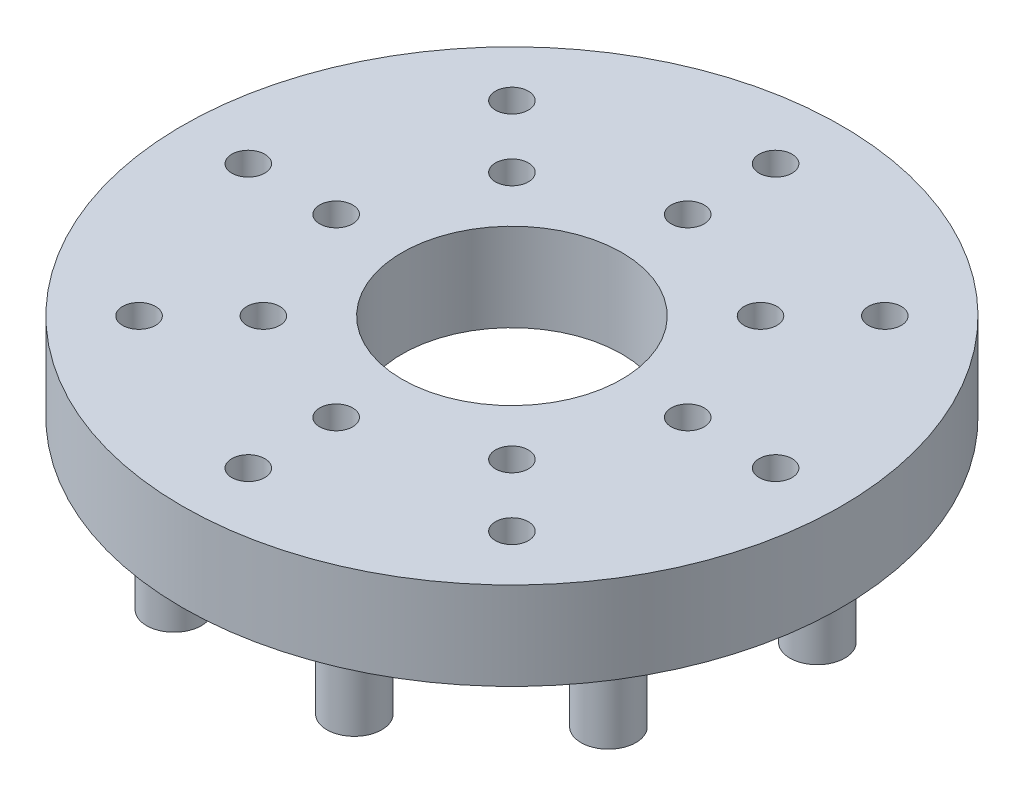
ISO-10303-21;
HEADER;
FILE_DESCRIPTION(('STEP AP214'),'2;1');
FILE_NAME('part.step','',(''),(''),'','','');
FILE_SCHEMA(('AUTOMOTIVE_DESIGN { 1 0 10303 214 1 1 1 1 }'));
ENDSEC;
DATA;
#1=APPLICATION_CONTEXT('core data for automotive mechanical design processes');
#2=APPLICATION_PROTOCOL_DEFINITION('international standard','automotive_design',2000,#1);
#3=PRODUCT_CONTEXT('',#1,'mechanical');
#4=PRODUCT('Part','Part','',(#3));
#5=PRODUCT_RELATED_PRODUCT_CATEGORY('part','',(#4));
#6=PRODUCT_DEFINITION_FORMATION('','',#4);
#7=PRODUCT_DEFINITION_CONTEXT('part definition',#1,'design');
#8=PRODUCT_DEFINITION('design','',#6,#7);
#9=PRODUCT_DEFINITION_SHAPE('','',#8);
#10=(LENGTH_UNIT() NAMED_UNIT(*) SI_UNIT(.MILLI.,.METRE.));
#11=(NAMED_UNIT(*) PLANE_ANGLE_UNIT() SI_UNIT($,.RADIAN.));
#12=(NAMED_UNIT(*) SI_UNIT($,.STERADIAN.) SOLID_ANGLE_UNIT());
#13=UNCERTAINTY_MEASURE_WITH_UNIT(LENGTH_MEASURE(1.E-05),#10,'distance_accuracy_value','');
#14=(GEOMETRIC_REPRESENTATION_CONTEXT(3) GLOBAL_UNCERTAINTY_ASSIGNED_CONTEXT((#13)) GLOBAL_UNIT_ASSIGNED_CONTEXT((#10,
#11,#12)) REPRESENTATION_CONTEXT('',''));
#15=CARTESIAN_POINT('',(0.,0.,0.));
#16=DIRECTION('',(0.,0.,1.));
#17=DIRECTION('',(1.,0.,0.));
#18=AXIS2_PLACEMENT_3D('',#15,#16,#17);
#19=CARTESIAN_POINT('',(0.,50.8,0.));
#20=DIRECTION('',(0.,-1.,0.));
#21=DIRECTION('',(0.,0.,-1.));
#22=AXIS2_PLACEMENT_3D('',#19,#20,#21);
#23=CYLINDRICAL_SURFACE('',#22,190.5);
#24=CARTESIAN_POINT('',(0.,50.8,0.));
#25=DIRECTION('',(0.,1.,0.));
#26=DIRECTION('',(0.,0.,1.));
#27=AXIS2_PLACEMENT_3D('',#24,#25,#26);
#28=CIRCLE('',#27,190.5);
#29=CARTESIAN_POINT('',(0.,50.8,190.5));
#30=VERTEX_POINT('',#29);
#31=EDGE_CURVE('E65',#30,#30,#28,.T.);
#32=ORIENTED_EDGE('',*,*,#31,.F.);
#33=EDGE_LOOP('',(#32));
#34=FACE_BOUND('',#33,.T.);
#35=CARTESIAN_POINT('',(0.,0.,0.));
#36=DIRECTION('',(0.,1.,0.));
#37=DIRECTION('',(0.,0.,1.));
#38=AXIS2_PLACEMENT_3D('',#35,#36,#37);
#39=CIRCLE('',#38,190.5);
#40=CARTESIAN_POINT('',(0.,0.,190.5));
#41=VERTEX_POINT('',#40);
#42=EDGE_CURVE('E66',#41,#41,#39,.T.);
#43=ORIENTED_EDGE('',*,*,#42,.T.);
#44=EDGE_LOOP('',(#43));
#45=FACE_BOUND('',#44,.T.);
#46=ADVANCED_FACE('F31',(#34,#45),#23,.T.);
#47=CARTESIAN_POINT('',(0.,50.8,0.));
#48=DIRECTION('',(0.,1.,0.));
#49=DIRECTION('',(0.,0.,1.));
#50=AXIS2_PLACEMENT_3D('',#47,#48,#49);
#51=PLANE('',#50);
#52=CARTESIAN_POINT('',(-71.8420489685507,50.8,-71.8420489685471));
#53=DIRECTION('',(0.,1.,0.));
#54=DIRECTION('',(0.,0.,1.));
#55=AXIS2_PLACEMENT_3D('',#52,#53,#54);
#56=CIRCLE('',#55,9.52500000000543);
#57=CARTESIAN_POINT('',(-71.8420489685507,50.8,-62.3170489685417));
#58=VERTEX_POINT('',#57);
#59=EDGE_CURVE('E108',#58,#58,#56,.T.);
#60=ORIENTED_EDGE('',*,*,#59,.F.);
#61=EDGE_LOOP('',(#60));
#62=FACE_BOUND('',#61,.T.);
#63=CARTESIAN_POINT('',(-101.599999999991,50.8,8.66293703438714E-12));
#64=DIRECTION('',(0.,1.,0.));
#65=DIRECTION('',(0.,0.,1.));
#66=AXIS2_PLACEMENT_3D('',#63,#64,#65);
#67=CIRCLE('',#66,9.52500000001183);
#68=CARTESIAN_POINT('',(-101.599999999991,50.8,9.5250000000205));
#69=VERTEX_POINT('',#68);
#70=EDGE_CURVE('E115',#69,#69,#67,.T.);
#71=ORIENTED_EDGE('',*,*,#70,.F.);
#72=EDGE_LOOP('',(#71));
#73=FACE_BOUND('',#72,.T.);
#74=CARTESIAN_POINT('',(-71.8420489685385,50.8,71.8420489685594));
#75=DIRECTION('',(0.,1.,0.));
#76=DIRECTION('',(0.,0.,1.));
#77=AXIS2_PLACEMENT_3D('',#74,#75,#76);
#78=CIRCLE('',#77,9.52500000001677);
#79=CARTESIAN_POINT('',(-71.8420489685385,50.8,81.3670489685761));
#80=VERTEX_POINT('',#79);
#81=EDGE_CURVE('E121',#80,#80,#78,.T.);
#82=ORIENTED_EDGE('',*,*,#81,.F.);
#83=EDGE_LOOP('',(#82));
#84=FACE_BOUND('',#83,.T.);
#85=CARTESIAN_POINT('',(1.73009892458156E-11,50.8,101.6));
#86=DIRECTION('',(0.,1.,0.));
#87=DIRECTION('',(0.,0.,1.));
#88=AXIS2_PLACEMENT_3D('',#85,#86,#87);
#89=CIRCLE('',#88,9.52500000001722);
#90=CARTESIAN_POINT('',(1.73009892458156E-11,50.8,111.125000000017));
#91=VERTEX_POINT('',#90);
#92=EDGE_CURVE('E127',#91,#91,#89,.T.);
#93=ORIENTED_EDGE('',*,*,#92,.F.);
#94=EDGE_LOOP('',(#93));
#95=FACE_BOUND('',#94,.T.);
#96=CARTESIAN_POINT('',(71.842048968568,50.8,71.8420489685471));
#97=DIRECTION('',(0.,1.,0.));
#98=DIRECTION('',(0.,0.,1.));
#99=AXIS2_PLACEMENT_3D('',#96,#97,#98);
#100=CIRCLE('',#99,9.52500000001284);
#101=CARTESIAN_POINT('',(71.842048968568,50.8,81.36704896856));
#102=VERTEX_POINT('',#101);
#103=EDGE_CURVE('E84',#102,#102,#100,.T.);
#104=ORIENTED_EDGE('',*,*,#103,.F.);
#105=EDGE_LOOP('',(#104));
#106=FACE_BOUND('',#105,.T.);
#107=CARTESIAN_POINT('',(101.600000000009,50.8,-8.6504946229078E-12));
#108=DIRECTION('',(0.,1.,0.));
#109=DIRECTION('',(0.,0.,1.));
#110=AXIS2_PLACEMENT_3D('',#107,#108,#109);
#111=CIRCLE('',#110,9.52500000000608);
#112=CARTESIAN_POINT('',(101.600000000009,50.8,9.52499999999743));
#113=VERTEX_POINT('',#112);
#114=EDGE_CURVE('E91',#113,#113,#111,.T.);
#115=ORIENTED_EDGE('',*,*,#114,.F.);
#116=EDGE_LOOP('',(#115));
#117=FACE_BOUND('',#116,.T.);
#118=CARTESIAN_POINT('',(71.8420489685558,50.8,-71.8420489685594));
#119=DIRECTION('',(0.,1.,0.));
#120=DIRECTION('',(0.,0.,1.));
#121=AXIS2_PLACEMENT_3D('',#118,#119,#120);
#122=CIRCLE('',#121,9.52500000000081);
#123=CARTESIAN_POINT('',(71.8420489685558,50.8,-62.3170489685585));
#124=VERTEX_POINT('',#123);
#125=EDGE_CURVE('E97',#124,#124,#122,.T.);
#126=ORIENTED_EDGE('',*,*,#125,.F.);
#127=EDGE_LOOP('',(#126));
#128=FACE_BOUND('',#127,.T.);
#129=CARTESIAN_POINT('',(0.,50.8,-152.4));
#130=DIRECTION('',(0.,1.,0.));
#131=DIRECTION('',(0.,0.,1.));
#132=AXIS2_PLACEMENT_3D('',#129,#130,#131);
#133=CIRCLE('',#132,9.525);
#134=CARTESIAN_POINT('',(0.,50.8,-142.875));
#135=VERTEX_POINT('',#134);
#136=EDGE_CURVE('E103',#135,#135,#133,.T.);
#137=ORIENTED_EDGE('',*,*,#136,.F.);
#138=EDGE_LOOP('',(#137));
#139=FACE_BOUND('',#138,.T.);
#140=CARTESIAN_POINT('',(107.763073452834,50.8,-107.763073452839));
#141=DIRECTION('',(0.,1.,0.));
#142=DIRECTION('',(0.,0.,1.));
#143=AXIS2_PLACEMENT_3D('',#140,#141,#142);
#144=CIRCLE('',#143,9.52500000000121);
#145=CARTESIAN_POINT('',(107.763073452834,50.8,-98.2380734528378));
#146=VERTEX_POINT('',#145);
#147=EDGE_CURVE('E169',#146,#146,#144,.T.);
#148=ORIENTED_EDGE('',*,*,#147,.F.);
#149=EDGE_LOOP('',(#148));
#150=FACE_BOUND('',#149,.T.);
#151=CARTESIAN_POINT('',(152.400000000013,50.8,-1.29757419343617E-11));
#152=DIRECTION('',(0.,1.,0.));
#153=DIRECTION('',(0.,0.,1.));
#154=AXIS2_PLACEMENT_3D('',#151,#152,#153);
#155=CIRCLE('',#154,9.52500000000913);
#156=CARTESIAN_POINT('',(152.400000000013,50.8,9.52499999999615));
#157=VERTEX_POINT('',#156);
#158=EDGE_CURVE('E163',#157,#157,#155,.T.);
#159=ORIENTED_EDGE('',*,*,#158,.F.);
#160=EDGE_LOOP('',(#159));
#161=FACE_BOUND('',#160,.T.);
#162=CARTESIAN_POINT('',(107.763073452852,50.8,107.763073452821));
#163=DIRECTION('',(0.,1.,0.));
#164=DIRECTION('',(0.,0.,1.));
#165=AXIS2_PLACEMENT_3D('',#162,#163,#164);
#166=CIRCLE('',#165,9.52500000001929);
#167=CARTESIAN_POINT('',(107.763073452852,50.8,117.28807345284));
#168=VERTEX_POINT('',#167);
#169=EDGE_CURVE('E157',#168,#168,#166,.T.);
#170=ORIENTED_EDGE('',*,*,#169,.F.);
#171=EDGE_LOOP('',(#170));
#172=FACE_BOUND('',#171,.T.);
#173=CARTESIAN_POINT('',(2.59514838687234E-11,50.8,152.4));
#174=DIRECTION('',(0.,1.,0.));
#175=DIRECTION('',(0.,0.,1.));
#176=AXIS2_PLACEMENT_3D('',#173,#174,#175);
#177=CIRCLE('',#176,9.52500000002584);
#178=CARTESIAN_POINT('',(2.59514838687234E-11,50.8,161.925000000026));
#179=VERTEX_POINT('',#178);
#180=EDGE_CURVE('E151',#179,#179,#177,.T.);
#181=ORIENTED_EDGE('',*,*,#180,.F.);
#182=EDGE_LOOP('',(#181));
#183=FACE_BOUND('',#182,.T.);
#184=CARTESIAN_POINT('',(-107.763073452808,50.8,107.763073452839));
#185=DIRECTION('',(0.,1.,0.));
#186=DIRECTION('',(0.,0.,1.));
#187=AXIS2_PLACEMENT_3D('',#184,#185,#186);
#188=CIRCLE('',#187,9.52500000002513);
#189=CARTESIAN_POINT('',(-107.763073452808,50.8,117.288073452864));
#190=VERTEX_POINT('',#189);
#191=EDGE_CURVE('E145',#190,#190,#188,.T.);
#192=ORIENTED_EDGE('',*,*,#191,.F.);
#193=EDGE_LOOP('',(#192));
#194=FACE_BOUND('',#193,.T.);
#195=CARTESIAN_POINT('',(-152.399999999987,50.8,1.29944055515807E-11));
#196=DIRECTION('',(0.,1.,0.));
#197=DIRECTION('',(0.,0.,1.));
#198=AXIS2_PLACEMENT_3D('',#195,#196,#197);
#199=CIRCLE('',#198,9.52500000001775);
#200=CARTESIAN_POINT('',(-152.399999999987,50.8,9.52500000003075));
#201=VERTEX_POINT('',#200);
#202=EDGE_CURVE('E139',#201,#201,#199,.T.);
#203=ORIENTED_EDGE('',*,*,#202,.F.);
#204=EDGE_LOOP('',(#203));
#205=FACE_BOUND('',#204,.T.);
#206=CARTESIAN_POINT('',(-107.763073452826,50.8,-107.763073452821));
#207=DIRECTION('',(0.,1.,0.));
#208=DIRECTION('',(0.,0.,1.));
#209=AXIS2_PLACEMENT_3D('',#206,#207,#208);
#210=CIRCLE('',#209,9.52500000000812);
#211=CARTESIAN_POINT('',(-107.763073452826,50.8,-98.2380734528125));
#212=VERTEX_POINT('',#211);
#213=EDGE_CURVE('E132',#212,#212,#210,.T.);
#214=ORIENTED_EDGE('',*,*,#213,.F.);
#215=EDGE_LOOP('',(#214));
#216=FACE_BOUND('',#215,.T.);
#217=CARTESIAN_POINT('',(0.,50.8,-101.6));
#218=DIRECTION('',(0.,1.,0.));
#219=DIRECTION('',(0.,0.,1.));
#220=AXIS2_PLACEMENT_3D('',#217,#218,#219);
#221=CIRCLE('',#220,9.525);
#222=CARTESIAN_POINT('',(0.,50.8,-92.075));
#223=VERTEX_POINT('',#222);
#224=EDGE_CURVE('E78',#223,#223,#221,.T.);
#225=ORIENTED_EDGE('',*,*,#224,.F.);
#226=EDGE_LOOP('',(#225));
#227=FACE_BOUND('',#226,.T.);
#228=CARTESIAN_POINT('',(0.,50.8,0.));
#229=DIRECTION('',(0.,1.,0.));
#230=DIRECTION('',(0.,0.,1.));
#231=AXIS2_PLACEMENT_3D('',#228,#229,#230);
#232=CIRCLE('',#231,63.5);
#233=CARTESIAN_POINT('',(0.,50.8,63.5));
#234=VERTEX_POINT('',#233);
#235=EDGE_CURVE('E72',#234,#234,#232,.T.);
#236=ORIENTED_EDGE('',*,*,#235,.F.);
#237=EDGE_LOOP('',(#236));
#238=FACE_BOUND('',#237,.T.);
#239=ORIENTED_EDGE('',*,*,#31,.T.);
#240=EDGE_LOOP('',(#239));
#241=FACE_BOUND('',#240,.T.);
#242=ADVANCED_FACE('F216',(#62,#73,#84,#95,#106,#117,#128,#139,#150,#161,#172,#183,#194,#205,
#216,#227,#238,#241),#51,.T.);
#243=CARTESIAN_POINT('',(0.,0.,0.));
#244=DIRECTION('',(0.,1.,0.));
#245=DIRECTION('',(0.,0.,1.));
#246=AXIS2_PLACEMENT_3D('',#243,#244,#245);
#247=PLANE('',#246);
#248=CARTESIAN_POINT('',(97.9608317162272,0.,-116.745173131333));
#249=DIRECTION('',(0.,1.,0.));
#250=DIRECTION('',(0.,0.,1.));
#251=AXIS2_PLACEMENT_3D('',#248,#249,#250);
#252=CIRCLE('',#251,15.875);
#253=CARTESIAN_POINT('',(97.9608317162272,0.,-100.870173131333));
#254=VERTEX_POINT('',#253);
#255=EDGE_CURVE('E10',#254,#254,#252,.F.);
#256=ORIENTED_EDGE('',*,*,#255,.F.);
#257=EDGE_LOOP('',(#256));
#258=FACE_BOUND('',#257,.T.);
#259=CARTESIAN_POINT('',(150.08470155906,0.,-26.4639822764417));
#260=DIRECTION('',(0.,1.,0.));
#261=DIRECTION('',(0.,0.,1.));
#262=AXIS2_PLACEMENT_3D('',#259,#260,#261);
#263=CIRCLE('',#262,15.875);
#264=CARTESIAN_POINT('',(150.08470155906,0.,-10.5889822764417));
#265=VERTEX_POINT('',#264);
#266=EDGE_CURVE('E37',#265,#265,#263,.F.);
#267=ORIENTED_EDGE('',*,*,#266,.F.);
#268=EDGE_LOOP('',(#267));
#269=FACE_BOUND('',#268,.T.);
#270=CARTESIAN_POINT('',(131.982271536749,0.,76.1999999999988));
#271=DIRECTION('',(0.,1.,0.));
#272=DIRECTION('',(0.,0.,1.));
#273=AXIS2_PLACEMENT_3D('',#270,#271,#272);
#274=CIRCLE('',#273,15.875);
#275=CARTESIAN_POINT('',(131.982271536749,0.,92.0749999999988));
#276=VERTEX_POINT('',#275);
#277=EDGE_CURVE('E41',#276,#276,#274,.F.);
#278=ORIENTED_EDGE('',*,*,#277,.F.);
#279=EDGE_LOOP('',(#278));
#280=FACE_BOUND('',#279,.T.);
#281=CARTESIAN_POINT('',(52.123869842833,0.,143.209155407772));
#282=DIRECTION('',(0.,1.,0.));
#283=DIRECTION('',(0.,0.,1.));
#284=AXIS2_PLACEMENT_3D('',#281,#282,#283);
#285=CIRCLE('',#284,15.875);
#286=CARTESIAN_POINT('',(52.123869842833,0.,159.084155407772));
#287=VERTEX_POINT('',#286);
#288=EDGE_CURVE('E45',#287,#287,#285,.F.);
#289=ORIENTED_EDGE('',*,*,#288,.F.);
#290=EDGE_LOOP('',(#289));
#291=FACE_BOUND('',#290,.T.);
#292=CARTESIAN_POINT('',(-52.1238698428311,0.,143.209155407773));
#293=DIRECTION('',(0.,1.,0.));
#294=DIRECTION('',(0.,0.,1.));
#295=AXIS2_PLACEMENT_3D('',#292,#293,#294);
#296=CIRCLE('',#295,15.875);
#297=CARTESIAN_POINT('',(-52.1238698428311,0.,159.084155407773));
#298=VERTEX_POINT('',#297);
#299=EDGE_CURVE('E50',#298,#298,#296,.F.);
#300=ORIENTED_EDGE('',*,*,#299,.F.);
#301=EDGE_LOOP('',(#300));
#302=FACE_BOUND('',#301,.T.);
#303=CARTESIAN_POINT('',(-131.982271536748,0.,76.2000000000006));
#304=DIRECTION('',(0.,1.,0.));
#305=DIRECTION('',(0.,0.,1.));
#306=AXIS2_PLACEMENT_3D('',#303,#304,#305);
#307=CIRCLE('',#306,15.875);
#308=CARTESIAN_POINT('',(-131.982271536748,0.,92.0750000000006));
#309=VERTEX_POINT('',#308);
#310=EDGE_CURVE('E53',#309,#309,#307,.F.);
#311=ORIENTED_EDGE('',*,*,#310,.F.);
#312=EDGE_LOOP('',(#311));
#313=FACE_BOUND('',#312,.T.);
#314=CARTESIAN_POINT('',(-150.084701559061,0.,-26.4639822764397));
#315=DIRECTION('',(0.,1.,0.));
#316=DIRECTION('',(0.,0.,1.));
#317=AXIS2_PLACEMENT_3D('',#314,#315,#316);
#318=CIRCLE('',#317,15.875);
#319=CARTESIAN_POINT('',(-150.084701559061,0.,-10.5889822764397));
#320=VERTEX_POINT('',#319);
#321=EDGE_CURVE('E56',#320,#320,#318,.F.);
#322=ORIENTED_EDGE('',*,*,#321,.F.);
#323=EDGE_LOOP('',(#322));
#324=FACE_BOUND('',#323,.T.);
#325=CARTESIAN_POINT('',(-97.9608317162288,0.,-116.745173131332));
#326=DIRECTION('',(0.,1.,0.));
#327=DIRECTION('',(0.,0.,1.));
#328=AXIS2_PLACEMENT_3D('',#325,#326,#327);
#329=CIRCLE('',#328,15.875);
#330=CARTESIAN_POINT('',(-97.9608317162288,0.,-100.870173131332));
#331=VERTEX_POINT('',#330);
#332=EDGE_CURVE('E59',#331,#331,#329,.F.);
#333=ORIENTED_EDGE('',*,*,#332,.F.);
#334=EDGE_LOOP('',(#333));
#335=FACE_BOUND('',#334,.T.);
#336=CARTESIAN_POINT('',(0.,0.,-152.4));
#337=DIRECTION('',(0.,1.,0.));
#338=DIRECTION('',(0.,0.,1.));
#339=AXIS2_PLACEMENT_3D('',#336,#337,#338);
#340=CIRCLE('',#339,15.875);
#341=CARTESIAN_POINT('',(0.,0.,-136.525));
#342=VERTEX_POINT('',#341);
#343=EDGE_CURVE('E62',#342,#342,#340,.F.);
#344=ORIENTED_EDGE('',*,*,#343,.F.);
#345=EDGE_LOOP('',(#344));
#346=FACE_BOUND('',#345,.T.);
#347=CARTESIAN_POINT('',(0.,0.,0.));
#348=DIRECTION('',(0.,1.,0.));
#349=DIRECTION('',(0.,0.,1.));
#350=AXIS2_PLACEMENT_3D('',#347,#348,#349);
#351=CIRCLE('',#350,63.5);
#352=CARTESIAN_POINT('',(0.,0.,63.5));
#353=VERTEX_POINT('',#352);
#354=EDGE_CURVE('E69',#353,#353,#351,.T.);
#355=ORIENTED_EDGE('',*,*,#354,.T.);
#356=EDGE_LOOP('',(#355));
#357=FACE_BOUND('',#356,.T.);
#358=ORIENTED_EDGE('',*,*,#42,.F.);
#359=EDGE_LOOP('',(#358));
#360=FACE_BOUND('',#359,.T.);
#361=ADVANCED_FACE('F221',(#258,#269,#280,#291,#302,#313,#324,#335,#346,#357,#360),#247,.F.);
#362=CARTESIAN_POINT('',(0.,0.,0.));
#363=DIRECTION('',(0.,1.,0.));
#364=DIRECTION('',(0.,0.,1.));
#365=AXIS2_PLACEMENT_3D('',#362,#363,#364);
#366=CYLINDRICAL_SURFACE('',#365,63.5);
#367=ORIENTED_EDGE('',*,*,#354,.F.);
#368=EDGE_LOOP('',(#367));
#369=FACE_BOUND('',#368,.T.);
#370=ORIENTED_EDGE('',*,*,#235,.T.);
#371=EDGE_LOOP('',(#370));
#372=FACE_BOUND('',#371,.T.);
#373=ADVANCED_FACE('F229',(#369,#372),#366,.F.);
#374=CARTESIAN_POINT('',(0.,7.874,-101.6));
#375=DIRECTION('',(0.,1.,0.));
#376=DIRECTION('',(0.,0.,1.));
#377=AXIS2_PLACEMENT_3D('',#374,#375,#376);
#378=CYLINDRICAL_SURFACE('',#377,9.525);
#379=CARTESIAN_POINT('',(0.,7.874,-101.6));
#380=DIRECTION('',(0.,1.,0.));
#381=DIRECTION('',(0.,0.,1.));
#382=AXIS2_PLACEMENT_3D('',#379,#380,#381);
#383=CIRCLE('',#382,9.525);
#384=CARTESIAN_POINT('',(0.,7.874,-92.075));
#385=VERTEX_POINT('',#384);
#386=EDGE_CURVE('E75',#385,#385,#383,.T.);
#387=ORIENTED_EDGE('',*,*,#386,.F.);
#388=EDGE_LOOP('',(#387));
#389=FACE_BOUND('',#388,.T.);
#390=ORIENTED_EDGE('',*,*,#224,.T.);
#391=EDGE_LOOP('',(#390));
#392=FACE_BOUND('',#391,.T.);
#393=ADVANCED_FACE('F234',(#389,#392),#378,.F.);
#394=CARTESIAN_POINT('',(0.,7.874,-101.6));
#395=DIRECTION('',(0.,1.,0.));
#396=DIRECTION('',(0.,0.,1.));
#397=AXIS2_PLACEMENT_3D('',#394,#395,#396);
#398=PLANE('',#397);
#399=ORIENTED_EDGE('',*,*,#386,.T.);
#400=EDGE_LOOP('',(#399));
#401=FACE_BOUND('',#400,.T.);
#402=ADVANCED_FACE('F241',(#401),#398,.T.);
#403=CARTESIAN_POINT('',(-107.763073452826,7.874,-107.763073452821));
#404=DIRECTION('',(0.,1.,0.));
#405=DIRECTION('',(0.,0.,1.));
#406=AXIS2_PLACEMENT_3D('',#403,#404,#405);
#407=CYLINDRICAL_SURFACE('',#406,9.52500000000812);
#408=CARTESIAN_POINT('',(-107.763073452826,7.874,-107.763073452821));
#409=DIRECTION('',(0.,1.,0.));
#410=DIRECTION('',(0.,0.,1.));
#411=AXIS2_PLACEMENT_3D('',#408,#409,#410);
#412=CIRCLE('',#411,9.52500000000812);
#413=CARTESIAN_POINT('',(-107.763073452826,7.874,-98.2380734528125));
#414=VERTEX_POINT('',#413);
#415=EDGE_CURVE('E135',#414,#414,#412,.T.);
#416=ORIENTED_EDGE('',*,*,#415,.F.);
#417=EDGE_LOOP('',(#416));
#418=FACE_BOUND('',#417,.T.);
#419=ORIENTED_EDGE('',*,*,#213,.T.);
#420=EDGE_LOOP('',(#419));
#421=FACE_BOUND('',#420,.T.);
#422=ADVANCED_FACE('F245',(#418,#421),#407,.F.);
#423=CARTESIAN_POINT('',(-107.763073452826,7.874,-107.763073452821));
#424=DIRECTION('',(0.,1.,0.));
#425=DIRECTION('',(0.,0.,1.));
#426=AXIS2_PLACEMENT_3D('',#423,#424,#425);
#427=PLANE('',#426);
#428=ORIENTED_EDGE('',*,*,#415,.T.);
#429=EDGE_LOOP('',(#428));
#430=FACE_BOUND('',#429,.T.);
#431=ADVANCED_FACE('F315',(#430),#427,.T.);
#432=CARTESIAN_POINT('',(-152.399999999987,7.874,1.29944055515807E-11));
#433=DIRECTION('',(0.,1.,0.));
#434=DIRECTION('',(0.,0.,1.));
#435=AXIS2_PLACEMENT_3D('',#432,#433,#434);
#436=CYLINDRICAL_SURFACE('',#435,9.52500000001775);
#437=CARTESIAN_POINT('',(-152.399999999987,7.874,1.29944055515807E-11));
#438=DIRECTION('',(0.,1.,0.));
#439=DIRECTION('',(0.,0.,1.));
#440=AXIS2_PLACEMENT_3D('',#437,#438,#439);
#441=CIRCLE('',#440,9.52500000001775);
#442=CARTESIAN_POINT('',(-152.399999999987,7.874,9.52500000003075));
#443=VERTEX_POINT('',#442);
#444=EDGE_CURVE('E142',#443,#443,#441,.T.);
#445=ORIENTED_EDGE('',*,*,#444,.F.);
#446=EDGE_LOOP('',(#445));
#447=FACE_BOUND('',#446,.T.);
#448=ORIENTED_EDGE('',*,*,#202,.T.);
#449=EDGE_LOOP('',(#448));
#450=FACE_BOUND('',#449,.T.);
#451=ADVANCED_FACE('F319',(#447,#450),#436,.F.);
#452=CARTESIAN_POINT('',(-152.399999999987,7.874,1.29944055515807E-11));
#453=DIRECTION('',(0.,1.,0.));
#454=DIRECTION('',(0.,0.,1.));
#455=AXIS2_PLACEMENT_3D('',#452,#453,#454);
#456=PLANE('',#455);
#457=ORIENTED_EDGE('',*,*,#444,.T.);
#458=EDGE_LOOP('',(#457));
#459=FACE_BOUND('',#458,.T.);
#460=ADVANCED_FACE('F323',(#459),#456,.T.);
#461=CARTESIAN_POINT('',(-107.763073452808,7.874,107.763073452839));
#462=DIRECTION('',(0.,1.,0.));
#463=DIRECTION('',(0.,0.,1.));
#464=AXIS2_PLACEMENT_3D('',#461,#462,#463);
#465=CYLINDRICAL_SURFACE('',#464,9.52500000002513);
#466=CARTESIAN_POINT('',(-107.763073452808,7.874,107.763073452839));
#467=DIRECTION('',(0.,1.,0.));
#468=DIRECTION('',(0.,0.,1.));
#469=AXIS2_PLACEMENT_3D('',#466,#467,#468);
#470=CIRCLE('',#469,9.52500000002513);
#471=CARTESIAN_POINT('',(-107.763073452808,7.874,117.288073452864));
#472=VERTEX_POINT('',#471);
#473=EDGE_CURVE('E148',#472,#472,#470,.T.);
#474=ORIENTED_EDGE('',*,*,#473,.F.);
#475=EDGE_LOOP('',(#474));
#476=FACE_BOUND('',#475,.T.);
#477=ORIENTED_EDGE('',*,*,#191,.T.);
#478=EDGE_LOOP('',(#477));
#479=FACE_BOUND('',#478,.T.);
#480=ADVANCED_FACE('F327',(#476,#479),#465,.F.);
#481=CARTESIAN_POINT('',(-107.763073452808,7.874,107.763073452839));
#482=DIRECTION('',(0.,1.,0.));
#483=DIRECTION('',(0.,0.,1.));
#484=AXIS2_PLACEMENT_3D('',#481,#482,#483);
#485=PLANE('',#484);
#486=ORIENTED_EDGE('',*,*,#473,.T.);
#487=EDGE_LOOP('',(#486));
#488=FACE_BOUND('',#487,.T.);
#489=ADVANCED_FACE('F331',(#488),#485,.T.);
#490=CARTESIAN_POINT('',(2.59514838687234E-11,7.874,152.4));
#491=DIRECTION('',(0.,1.,0.));
#492=DIRECTION('',(0.,0.,1.));
#493=AXIS2_PLACEMENT_3D('',#490,#491,#492);
#494=CYLINDRICAL_SURFACE('',#493,9.52500000002584);
#495=CARTESIAN_POINT('',(2.59514838687234E-11,7.874,152.4));
#496=DIRECTION('',(0.,1.,0.));
#497=DIRECTION('',(0.,0.,1.));
#498=AXIS2_PLACEMENT_3D('',#495,#496,#497);
#499=CIRCLE('',#498,9.52500000002584);
#500=CARTESIAN_POINT('',(2.59514838687234E-11,7.874,161.925000000026));
#501=VERTEX_POINT('',#500);
#502=EDGE_CURVE('E154',#501,#501,#499,.T.);
#503=ORIENTED_EDGE('',*,*,#502,.F.);
#504=EDGE_LOOP('',(#503));
#505=FACE_BOUND('',#504,.T.);
#506=ORIENTED_EDGE('',*,*,#180,.T.);
#507=EDGE_LOOP('',(#506));
#508=FACE_BOUND('',#507,.T.);
#509=ADVANCED_FACE('F335',(#505,#508),#494,.F.);
#510=CARTESIAN_POINT('',(2.59514838687234E-11,7.874,152.4));
#511=DIRECTION('',(0.,1.,0.));
#512=DIRECTION('',(0.,0.,1.));
#513=AXIS2_PLACEMENT_3D('',#510,#511,#512);
#514=PLANE('',#513);
#515=ORIENTED_EDGE('',*,*,#502,.T.);
#516=EDGE_LOOP('',(#515));
#517=FACE_BOUND('',#516,.T.);
#518=ADVANCED_FACE('F339',(#517),#514,.T.);
#519=CARTESIAN_POINT('',(107.763073452852,7.874,107.763073452821));
#520=DIRECTION('',(0.,1.,0.));
#521=DIRECTION('',(0.,0.,1.));
#522=AXIS2_PLACEMENT_3D('',#519,#520,#521);
#523=CYLINDRICAL_SURFACE('',#522,9.52500000001929);
#524=CARTESIAN_POINT('',(107.763073452852,7.874,107.763073452821));
#525=DIRECTION('',(0.,1.,0.));
#526=DIRECTION('',(0.,0.,1.));
#527=AXIS2_PLACEMENT_3D('',#524,#525,#526);
#528=CIRCLE('',#527,9.52500000001929);
#529=CARTESIAN_POINT('',(107.763073452852,7.874,117.28807345284));
#530=VERTEX_POINT('',#529);
#531=EDGE_CURVE('E160',#530,#530,#528,.T.);
#532=ORIENTED_EDGE('',*,*,#531,.F.);
#533=EDGE_LOOP('',(#532));
#534=FACE_BOUND('',#533,.T.);
#535=ORIENTED_EDGE('',*,*,#169,.T.);
#536=EDGE_LOOP('',(#535));
#537=FACE_BOUND('',#536,.T.);
#538=ADVANCED_FACE('F343',(#534,#537),#523,.F.);
#539=CARTESIAN_POINT('',(107.763073452852,7.874,107.763073452821));
#540=DIRECTION('',(0.,1.,0.));
#541=DIRECTION('',(0.,0.,1.));
#542=AXIS2_PLACEMENT_3D('',#539,#540,#541);
#543=PLANE('',#542);
#544=ORIENTED_EDGE('',*,*,#531,.T.);
#545=EDGE_LOOP('',(#544));
#546=FACE_BOUND('',#545,.T.);
#547=ADVANCED_FACE('F347',(#546),#543,.T.);
#548=CARTESIAN_POINT('',(152.400000000013,7.874,-1.29757419343617E-11));
#549=DIRECTION('',(0.,1.,0.));
#550=DIRECTION('',(0.,0.,1.));
#551=AXIS2_PLACEMENT_3D('',#548,#549,#550);
#552=CYLINDRICAL_SURFACE('',#551,9.52500000000913);
#553=CARTESIAN_POINT('',(152.400000000013,7.874,-1.29757419343617E-11));
#554=DIRECTION('',(0.,1.,0.));
#555=DIRECTION('',(0.,0.,1.));
#556=AXIS2_PLACEMENT_3D('',#553,#554,#555);
#557=CIRCLE('',#556,9.52500000000913);
#558=CARTESIAN_POINT('',(152.400000000013,7.874,9.52499999999615));
#559=VERTEX_POINT('',#558);
#560=EDGE_CURVE('E166',#559,#559,#557,.T.);
#561=ORIENTED_EDGE('',*,*,#560,.F.);
#562=EDGE_LOOP('',(#561));
#563=FACE_BOUND('',#562,.T.);
#564=ORIENTED_EDGE('',*,*,#158,.T.);
#565=EDGE_LOOP('',(#564));
#566=FACE_BOUND('',#565,.T.);
#567=ADVANCED_FACE('F351',(#563,#566),#552,.F.);
#568=CARTESIAN_POINT('',(152.400000000013,7.874,-1.29757419343617E-11));
#569=DIRECTION('',(0.,1.,0.));
#570=DIRECTION('',(0.,0.,1.));
#571=AXIS2_PLACEMENT_3D('',#568,#569,#570);
#572=PLANE('',#571);
#573=ORIENTED_EDGE('',*,*,#560,.T.);
#574=EDGE_LOOP('',(#573));
#575=FACE_BOUND('',#574,.T.);
#576=ADVANCED_FACE('F355',(#575),#572,.T.);
#577=CARTESIAN_POINT('',(107.763073452834,7.874,-107.763073452839));
#578=DIRECTION('',(0.,1.,0.));
#579=DIRECTION('',(0.,0.,1.));
#580=AXIS2_PLACEMENT_3D('',#577,#578,#579);
#581=CYLINDRICAL_SURFACE('',#580,9.52500000000121);
#582=CARTESIAN_POINT('',(107.763073452834,7.874,-107.763073452839));
#583=DIRECTION('',(0.,1.,0.));
#584=DIRECTION('',(0.,0.,1.));
#585=AXIS2_PLACEMENT_3D('',#582,#583,#584);
#586=CIRCLE('',#585,9.52500000000121);
#587=CARTESIAN_POINT('',(107.763073452834,7.874,-98.2380734528378));
#588=VERTEX_POINT('',#587);
#589=EDGE_CURVE('E112',#588,#588,#586,.T.);
#590=ORIENTED_EDGE('',*,*,#589,.F.);
#591=EDGE_LOOP('',(#590));
#592=FACE_BOUND('',#591,.T.);
#593=ORIENTED_EDGE('',*,*,#147,.T.);
#594=EDGE_LOOP('',(#593));
#595=FACE_BOUND('',#594,.T.);
#596=ADVANCED_FACE('F359',(#592,#595),#581,.F.);
#597=CARTESIAN_POINT('',(107.763073452834,7.874,-107.763073452839));
#598=DIRECTION('',(0.,1.,0.));
#599=DIRECTION('',(0.,0.,1.));
#600=AXIS2_PLACEMENT_3D('',#597,#598,#599);
#601=PLANE('',#600);
#602=ORIENTED_EDGE('',*,*,#589,.T.);
#603=EDGE_LOOP('',(#602));
#604=FACE_BOUND('',#603,.T.);
#605=ADVANCED_FACE('F276',(#604),#601,.T.);
#606=CARTESIAN_POINT('',(0.,7.874,-152.4));
#607=DIRECTION('',(0.,1.,0.));
#608=DIRECTION('',(0.,0.,1.));
#609=AXIS2_PLACEMENT_3D('',#606,#607,#608);
#610=CYLINDRICAL_SURFACE('',#609,9.525);
#611=CARTESIAN_POINT('',(0.,7.874,-152.4));
#612=DIRECTION('',(0.,1.,0.));
#613=DIRECTION('',(0.,0.,1.));
#614=AXIS2_PLACEMENT_3D('',#611,#612,#613);
#615=CIRCLE('',#614,9.525);
#616=CARTESIAN_POINT('',(0.,7.874,-142.875));
#617=VERTEX_POINT('',#616);
#618=EDGE_CURVE('E81',#617,#617,#615,.T.);
#619=ORIENTED_EDGE('',*,*,#618,.F.);
#620=EDGE_LOOP('',(#619));
#621=FACE_BOUND('',#620,.T.);
#622=ORIENTED_EDGE('',*,*,#136,.T.);
#623=EDGE_LOOP('',(#622));
#624=FACE_BOUND('',#623,.T.);
#625=ADVANCED_FACE('F273',(#621,#624),#610,.F.);
#626=CARTESIAN_POINT('',(0.,7.874,-152.4));
#627=DIRECTION('',(0.,1.,0.));
#628=DIRECTION('',(0.,0.,1.));
#629=AXIS2_PLACEMENT_3D('',#626,#627,#628);
#630=PLANE('',#629);
#631=ORIENTED_EDGE('',*,*,#618,.T.);
#632=EDGE_LOOP('',(#631));
#633=FACE_BOUND('',#632,.T.);
#634=ADVANCED_FACE('F268',(#633),#630,.T.);
#635=CARTESIAN_POINT('',(71.8420489685558,7.874,-71.8420489685594));
#636=DIRECTION('',(0.,1.,0.));
#637=DIRECTION('',(0.,0.,1.));
#638=AXIS2_PLACEMENT_3D('',#635,#636,#637);
#639=CYLINDRICAL_SURFACE('',#638,9.52500000000081);
#640=CARTESIAN_POINT('',(71.8420489685558,7.874,-71.8420489685594));
#641=DIRECTION('',(0.,1.,0.));
#642=DIRECTION('',(0.,0.,1.));
#643=AXIS2_PLACEMENT_3D('',#640,#641,#642);
#644=CIRCLE('',#643,9.52500000000081);
#645=CARTESIAN_POINT('',(71.8420489685558,7.874,-62.3170489685585));
#646=VERTEX_POINT('',#645);
#647=EDGE_CURVE('E100',#646,#646,#644,.T.);
#648=ORIENTED_EDGE('',*,*,#647,.F.);
#649=EDGE_LOOP('',(#648));
#650=FACE_BOUND('',#649,.T.);
#651=ORIENTED_EDGE('',*,*,#125,.T.);
#652=EDGE_LOOP('',(#651));
#653=FACE_BOUND('',#652,.T.);
#654=ADVANCED_FACE('F265',(#650,#653),#639,.F.);
#655=CARTESIAN_POINT('',(71.8420489685558,7.874,-71.8420489685594));
#656=DIRECTION('',(0.,1.,0.));
#657=DIRECTION('',(0.,0.,1.));
#658=AXIS2_PLACEMENT_3D('',#655,#656,#657);
#659=PLANE('',#658);
#660=ORIENTED_EDGE('',*,*,#647,.T.);
#661=EDGE_LOOP('',(#660));
#662=FACE_BOUND('',#661,.T.);
#663=ADVANCED_FACE('F260',(#662),#659,.T.);
#664=CARTESIAN_POINT('',(101.600000000009,7.874,-8.6504946229078E-12));
#665=DIRECTION('',(0.,1.,0.));
#666=DIRECTION('',(0.,0.,1.));
#667=AXIS2_PLACEMENT_3D('',#664,#665,#666);
#668=CYLINDRICAL_SURFACE('',#667,9.52500000000608);
#669=CARTESIAN_POINT('',(101.600000000009,7.874,-8.6504946229078E-12));
#670=DIRECTION('',(0.,1.,0.));
#671=DIRECTION('',(0.,0.,1.));
#672=AXIS2_PLACEMENT_3D('',#669,#670,#671);
#673=CIRCLE('',#672,9.52500000000608);
#674=CARTESIAN_POINT('',(101.600000000009,7.874,9.52499999999743));
#675=VERTEX_POINT('',#674);
#676=EDGE_CURVE('E94',#675,#675,#673,.T.);
#677=ORIENTED_EDGE('',*,*,#676,.F.);
#678=EDGE_LOOP('',(#677));
#679=FACE_BOUND('',#678,.T.);
#680=ORIENTED_EDGE('',*,*,#114,.T.);
#681=EDGE_LOOP('',(#680));
#682=FACE_BOUND('',#681,.T.);
#683=ADVANCED_FACE('F257',(#679,#682),#668,.F.);
#684=CARTESIAN_POINT('',(101.600000000009,7.874,-8.6504946229078E-12));
#685=DIRECTION('',(0.,1.,0.));
#686=DIRECTION('',(0.,0.,1.));
#687=AXIS2_PLACEMENT_3D('',#684,#685,#686);
#688=PLANE('',#687);
#689=ORIENTED_EDGE('',*,*,#676,.T.);
#690=EDGE_LOOP('',(#689));
#691=FACE_BOUND('',#690,.T.);
#692=ADVANCED_FACE('F251',(#691),#688,.T.);
#693=CARTESIAN_POINT('',(71.842048968568,7.874,71.8420489685471));
#694=DIRECTION('',(0.,1.,0.));
#695=DIRECTION('',(0.,0.,1.));
#696=AXIS2_PLACEMENT_3D('',#693,#694,#695);
#697=CYLINDRICAL_SURFACE('',#696,9.52500000001284);
#698=CARTESIAN_POINT('',(71.842048968568,7.874,71.8420489685471));
#699=DIRECTION('',(0.,1.,0.));
#700=DIRECTION('',(0.,0.,1.));
#701=AXIS2_PLACEMENT_3D('',#698,#699,#700);
#702=CIRCLE('',#701,9.52500000001284);
#703=CARTESIAN_POINT('',(71.842048968568,7.874,81.36704896856));
#704=VERTEX_POINT('',#703);
#705=EDGE_CURVE('E87',#704,#704,#702,.T.);
#706=ORIENTED_EDGE('',*,*,#705,.F.);
#707=EDGE_LOOP('',(#706));
#708=FACE_BOUND('',#707,.T.);
#709=ORIENTED_EDGE('',*,*,#103,.T.);
#710=EDGE_LOOP('',(#709));
#711=FACE_BOUND('',#710,.T.);
#712=ADVANCED_FACE('F247',(#708,#711),#697,.F.);
#713=CARTESIAN_POINT('',(71.842048968568,7.874,71.8420489685471));
#714=DIRECTION('',(0.,1.,0.));
#715=DIRECTION('',(0.,0.,1.));
#716=AXIS2_PLACEMENT_3D('',#713,#714,#715);
#717=PLANE('',#716);
#718=ORIENTED_EDGE('',*,*,#705,.T.);
#719=EDGE_LOOP('',(#718));
#720=FACE_BOUND('',#719,.T.);
#721=ADVANCED_FACE('F250',(#720),#717,.T.);
#722=CARTESIAN_POINT('',(1.73009892458156E-11,7.874,101.6));
#723=DIRECTION('',(0.,1.,0.));
#724=DIRECTION('',(0.,0.,1.));
#725=AXIS2_PLACEMENT_3D('',#722,#723,#724);
#726=CYLINDRICAL_SURFACE('',#725,9.52500000001722);
#727=CARTESIAN_POINT('',(1.73009892458156E-11,7.874,101.6));
#728=DIRECTION('',(0.,1.,0.));
#729=DIRECTION('',(0.,0.,1.));
#730=AXIS2_PLACEMENT_3D('',#727,#728,#729);
#731=CIRCLE('',#730,9.52500000001722);
#732=CARTESIAN_POINT('',(1.73009892458156E-11,7.874,111.125000000017));
#733=VERTEX_POINT('',#732);
#734=EDGE_CURVE('E88',#733,#733,#731,.T.);
#735=ORIENTED_EDGE('',*,*,#734,.F.);
#736=EDGE_LOOP('',(#735));
#737=FACE_BOUND('',#736,.T.);
#738=ORIENTED_EDGE('',*,*,#92,.T.);
#739=EDGE_LOOP('',(#738));
#740=FACE_BOUND('',#739,.T.);
#741=ADVANCED_FACE('F255',(#737,#740),#726,.F.);
#742=CARTESIAN_POINT('',(1.73009892458156E-11,7.874,101.6));
#743=DIRECTION('',(0.,1.,0.));
#744=DIRECTION('',(0.,0.,1.));
#745=AXIS2_PLACEMENT_3D('',#742,#743,#744);
#746=PLANE('',#745);
#747=ORIENTED_EDGE('',*,*,#734,.T.);
#748=EDGE_LOOP('',(#747));
#749=FACE_BOUND('',#748,.T.);
#750=ADVANCED_FACE('F302',(#749),#746,.T.);
#751=CARTESIAN_POINT('',(-71.8420489685385,7.874,71.8420489685594));
#752=DIRECTION('',(0.,1.,0.));
#753=DIRECTION('',(0.,0.,1.));
#754=AXIS2_PLACEMENT_3D('',#751,#752,#753);
#755=CYLINDRICAL_SURFACE('',#754,9.52500000001677);
#756=CARTESIAN_POINT('',(-71.8420489685385,7.874,71.8420489685594));
#757=DIRECTION('',(0.,1.,0.));
#758=DIRECTION('',(0.,0.,1.));
#759=AXIS2_PLACEMENT_3D('',#756,#757,#758);
#760=CIRCLE('',#759,9.52500000001677);
#761=CARTESIAN_POINT('',(-71.8420489685385,7.874,81.3670489685761));
#762=VERTEX_POINT('',#761);
#763=EDGE_CURVE('E124',#762,#762,#760,.T.);
#764=ORIENTED_EDGE('',*,*,#763,.F.);
#765=EDGE_LOOP('',(#764));
#766=FACE_BOUND('',#765,.T.);
#767=ORIENTED_EDGE('',*,*,#81,.T.);
#768=EDGE_LOOP('',(#767));
#769=FACE_BOUND('',#768,.T.);
#770=ADVANCED_FACE('F299',(#766,#769),#755,.F.);
#771=CARTESIAN_POINT('',(-71.8420489685385,7.874,71.8420489685594));
#772=DIRECTION('',(0.,1.,0.));
#773=DIRECTION('',(0.,0.,1.));
#774=AXIS2_PLACEMENT_3D('',#771,#772,#773);
#775=PLANE('',#774);
#776=ORIENTED_EDGE('',*,*,#763,.T.);
#777=EDGE_LOOP('',(#776));
#778=FACE_BOUND('',#777,.T.);
#779=ADVANCED_FACE('F294',(#778),#775,.T.);
#780=CARTESIAN_POINT('',(-101.599999999991,7.874,8.66293703438714E-12));
#781=DIRECTION('',(0.,1.,0.));
#782=DIRECTION('',(0.,0.,1.));
#783=AXIS2_PLACEMENT_3D('',#780,#781,#782);
#784=CYLINDRICAL_SURFACE('',#783,9.52500000001183);
#785=CARTESIAN_POINT('',(-101.599999999991,7.874,8.66293703438714E-12));
#786=DIRECTION('',(0.,1.,0.));
#787=DIRECTION('',(0.,0.,1.));
#788=AXIS2_PLACEMENT_3D('',#785,#786,#787);
#789=CIRCLE('',#788,9.52500000001183);
#790=CARTESIAN_POINT('',(-101.599999999991,7.874,9.5250000000205));
#791=VERTEX_POINT('',#790);
#792=EDGE_CURVE('E118',#791,#791,#789,.T.);
#793=ORIENTED_EDGE('',*,*,#792,.F.);
#794=EDGE_LOOP('',(#793));
#795=FACE_BOUND('',#794,.T.);
#796=ORIENTED_EDGE('',*,*,#70,.T.);
#797=EDGE_LOOP('',(#796));
#798=FACE_BOUND('',#797,.T.);
#799=ADVANCED_FACE('F291',(#795,#798),#784,.F.);
#800=CARTESIAN_POINT('',(-101.599999999991,7.874,8.66293703438714E-12));
#801=DIRECTION('',(0.,1.,0.));
#802=DIRECTION('',(0.,0.,1.));
#803=AXIS2_PLACEMENT_3D('',#800,#801,#802);
#804=PLANE('',#803);
#805=ORIENTED_EDGE('',*,*,#792,.T.);
#806=EDGE_LOOP('',(#805));
#807=FACE_BOUND('',#806,.T.);
#808=ADVANCED_FACE('F285',(#807),#804,.T.);
#809=CARTESIAN_POINT('',(-71.8420489685507,7.874,-71.8420489685471));
#810=DIRECTION('',(0.,1.,0.));
#811=DIRECTION('',(0.,0.,1.));
#812=AXIS2_PLACEMENT_3D('',#809,#810,#811);
#813=CYLINDRICAL_SURFACE('',#812,9.52500000000543);
#814=CARTESIAN_POINT('',(-71.8420489685507,7.874,-71.8420489685471));
#815=DIRECTION('',(0.,1.,0.));
#816=DIRECTION('',(0.,0.,1.));
#817=AXIS2_PLACEMENT_3D('',#814,#815,#816);
#818=CIRCLE('',#817,9.52500000000543);
#819=CARTESIAN_POINT('',(-71.8420489685507,7.874,-62.3170489685417));
#820=VERTEX_POINT('',#819);
#821=EDGE_CURVE('E111',#820,#820,#818,.T.);
#822=ORIENTED_EDGE('',*,*,#821,.F.);
#823=EDGE_LOOP('',(#822));
#824=FACE_BOUND('',#823,.T.);
#825=ORIENTED_EDGE('',*,*,#59,.T.);
#826=EDGE_LOOP('',(#825));
#827=FACE_BOUND('',#826,.T.);
#828=ADVANCED_FACE('F281',(#824,#827),#813,.F.);
#829=CARTESIAN_POINT('',(-71.8420489685507,7.874,-71.8420489685471));
#830=DIRECTION('',(0.,1.,0.));
#831=DIRECTION('',(0.,0.,1.));
#832=AXIS2_PLACEMENT_3D('',#829,#830,#831);
#833=PLANE('',#832);
#834=ORIENTED_EDGE('',*,*,#821,.T.);
#835=EDGE_LOOP('',(#834));
#836=FACE_BOUND('',#835,.T.);
#837=ADVANCED_FACE('F284',(#836),#833,.T.);
#838=CARTESIAN_POINT('',(0.,-50.8,-152.4));
#839=DIRECTION('',(0.,1.,0.));
#840=DIRECTION('',(0.,0.,1.));
#841=AXIS2_PLACEMENT_3D('',#838,#839,#840);
#842=CYLINDRICAL_SURFACE('',#841,15.875);
#843=CARTESIAN_POINT('',(0.,-50.8,-152.4));
#844=DIRECTION('',(0.,-1.,0.));
#845=DIRECTION('',(0.,0.,-1.));
#846=AXIS2_PLACEMENT_3D('',#843,#844,#845);
#847=CIRCLE('',#846,15.875);
#848=CARTESIAN_POINT('',(0.,-50.8,-168.275));
#849=VERTEX_POINT('',#848);
#850=EDGE_CURVE('E136',#849,#849,#847,.T.);
#851=ORIENTED_EDGE('',*,*,#850,.F.);
#852=EDGE_LOOP('',(#851));
#853=FACE_BOUND('',#852,.T.);
#854=ORIENTED_EDGE('',*,*,#343,.T.);
#855=EDGE_LOOP('',(#854));
#856=FACE_BOUND('',#855,.T.);
#857=ADVANCED_FACE('F289',(#853,#856),#842,.T.);
#858=CARTESIAN_POINT('',(0.,-50.8,-152.4));
#859=DIRECTION('',(0.,-1.,0.));
#860=DIRECTION('',(0.,0.,-1.));
#861=AXIS2_PLACEMENT_3D('',#858,#859,#860);
#862=PLANE('',#861);
#863=ORIENTED_EDGE('',*,*,#850,.T.);
#864=EDGE_LOOP('',(#863));
#865=FACE_BOUND('',#864,.T.);
#866=ADVANCED_FACE('F369',(#865),#862,.T.);
#867=CARTESIAN_POINT('',(-97.9608317162288,-50.8,-116.745173131332));
#868=DIRECTION('',(0.,1.,0.));
#869=DIRECTION('',(0.,0.,1.));
#870=AXIS2_PLACEMENT_3D('',#867,#868,#869);
#871=CYLINDRICAL_SURFACE('',#870,15.875);
#872=CARTESIAN_POINT('',(-97.9608317162288,-50.8,-116.745173131332));
#873=DIRECTION('',(0.,-1.,0.));
#874=DIRECTION('',(0.,0.,-1.));
#875=AXIS2_PLACEMENT_3D('',#872,#873,#874);
#876=CIRCLE('',#875,15.875);
#877=CARTESIAN_POINT('',(-97.9608317162288,-50.8,-132.620173131332));
#878=VERTEX_POINT('',#877);
#879=EDGE_CURVE('E176',#878,#878,#876,.T.);
#880=ORIENTED_EDGE('',*,*,#879,.F.);
#881=EDGE_LOOP('',(#880));
#882=FACE_BOUND('',#881,.T.);
#883=ORIENTED_EDGE('',*,*,#332,.T.);
#884=EDGE_LOOP('',(#883));
#885=FACE_BOUND('',#884,.T.);
#886=ADVANCED_FACE('F373',(#882,#885),#871,.T.);
#887=CARTESIAN_POINT('',(-97.9608317162288,-50.8,-116.745173131332));
#888=DIRECTION('',(0.,-1.,0.));
#889=DIRECTION('',(0.,0.,-1.));
#890=AXIS2_PLACEMENT_3D('',#887,#888,#889);
#891=PLANE('',#890);
#892=ORIENTED_EDGE('',*,*,#879,.T.);
#893=EDGE_LOOP('',(#892));
#894=FACE_BOUND('',#893,.T.);
#895=ADVANCED_FACE('F377',(#894),#891,.T.);
#896=CARTESIAN_POINT('',(-150.084701559061,-50.8,-26.4639822764397));
#897=DIRECTION('',(0.,1.,0.));
#898=DIRECTION('',(0.,0.,1.));
#899=AXIS2_PLACEMENT_3D('',#896,#897,#898);
#900=CYLINDRICAL_SURFACE('',#899,15.875);
#901=CARTESIAN_POINT('',(-150.084701559061,-50.8,-26.4639822764397));
#902=DIRECTION('',(0.,-1.,0.));
#903=DIRECTION('',(0.,0.,-1.));
#904=AXIS2_PLACEMENT_3D('',#901,#902,#903);
#905=CIRCLE('',#904,15.875);
#906=CARTESIAN_POINT('',(-150.084701559061,-50.8,-42.3389822764397));
#907=VERTEX_POINT('',#906);
#908=EDGE_CURVE('E179',#907,#907,#905,.T.);
#909=ORIENTED_EDGE('',*,*,#908,.F.);
#910=EDGE_LOOP('',(#909));
#911=FACE_BOUND('',#910,.T.);
#912=ORIENTED_EDGE('',*,*,#321,.T.);
#913=EDGE_LOOP('',(#912));
#914=FACE_BOUND('',#913,.T.);
#915=ADVANCED_FACE('F381',(#911,#914),#900,.T.);
#916=CARTESIAN_POINT('',(-150.084701559061,-50.8,-26.4639822764397));
#917=DIRECTION('',(0.,-1.,0.));
#918=DIRECTION('',(0.,0.,-1.));
#919=AXIS2_PLACEMENT_3D('',#916,#917,#918);
#920=PLANE('',#919);
#921=ORIENTED_EDGE('',*,*,#908,.T.);
#922=EDGE_LOOP('',(#921));
#923=FACE_BOUND('',#922,.T.);
#924=ADVANCED_FACE('F385',(#923),#920,.T.);
#925=CARTESIAN_POINT('',(-131.982271536748,-50.8,76.2000000000006));
#926=DIRECTION('',(0.,1.,0.));
#927=DIRECTION('',(0.,0.,1.));
#928=AXIS2_PLACEMENT_3D('',#925,#926,#927);
#929=CYLINDRICAL_SURFACE('',#928,15.875);
#930=CARTESIAN_POINT('',(-131.982271536748,-50.8,76.2000000000006));
#931=DIRECTION('',(0.,-1.,0.));
#932=DIRECTION('',(0.,0.,-1.));
#933=AXIS2_PLACEMENT_3D('',#930,#931,#932);
#934=CIRCLE('',#933,15.875);
#935=CARTESIAN_POINT('',(-131.982271536748,-50.8,60.3250000000006));
#936=VERTEX_POINT('',#935);
#937=EDGE_CURVE('E182',#936,#936,#934,.T.);
#938=ORIENTED_EDGE('',*,*,#937,.F.);
#939=EDGE_LOOP('',(#938));
#940=FACE_BOUND('',#939,.T.);
#941=ORIENTED_EDGE('',*,*,#310,.T.);
#942=EDGE_LOOP('',(#941));
#943=FACE_BOUND('',#942,.T.);
#944=ADVANCED_FACE('F389',(#940,#943),#929,.T.);
#945=CARTESIAN_POINT('',(-131.982271536748,-50.8,76.2000000000006));
#946=DIRECTION('',(0.,-1.,0.));
#947=DIRECTION('',(0.,0.,-1.));
#948=AXIS2_PLACEMENT_3D('',#945,#946,#947);
#949=PLANE('',#948);
#950=ORIENTED_EDGE('',*,*,#937,.T.);
#951=EDGE_LOOP('',(#950));
#952=FACE_BOUND('',#951,.T.);
#953=ADVANCED_FACE('F393',(#952),#949,.T.);
#954=CARTESIAN_POINT('',(-52.1238698428311,-50.8,143.209155407773));
#955=DIRECTION('',(0.,1.,0.));
#956=DIRECTION('',(0.,0.,1.));
#957=AXIS2_PLACEMENT_3D('',#954,#955,#956);
#958=CYLINDRICAL_SURFACE('',#957,15.875);
#959=CARTESIAN_POINT('',(-52.1238698428311,-50.8,143.209155407773));
#960=DIRECTION('',(0.,-1.,0.));
#961=DIRECTION('',(0.,0.,-1.));
#962=AXIS2_PLACEMENT_3D('',#959,#960,#961);
#963=CIRCLE('',#962,15.875);
#964=CARTESIAN_POINT('',(-52.1238698428311,-50.8,127.334155407773));
#965=VERTEX_POINT('',#964);
#966=EDGE_CURVE('E185',#965,#965,#963,.T.);
#967=ORIENTED_EDGE('',*,*,#966,.F.);
#968=EDGE_LOOP('',(#967));
#969=FACE_BOUND('',#968,.T.);
#970=ORIENTED_EDGE('',*,*,#299,.T.);
#971=EDGE_LOOP('',(#970));
#972=FACE_BOUND('',#971,.T.);
#973=ADVANCED_FACE('F397',(#969,#972),#958,.T.);
#974=CARTESIAN_POINT('',(-52.1238698428311,-50.8,143.209155407773));
#975=DIRECTION('',(0.,-1.,0.));
#976=DIRECTION('',(0.,0.,-1.));
#977=AXIS2_PLACEMENT_3D('',#974,#975,#976);
#978=PLANE('',#977);
#979=ORIENTED_EDGE('',*,*,#966,.T.);
#980=EDGE_LOOP('',(#979));
#981=FACE_BOUND('',#980,.T.);
#982=ADVANCED_FACE('F401',(#981),#978,.T.);
#983=CARTESIAN_POINT('',(52.123869842833,-50.8,143.209155407772));
#984=DIRECTION('',(0.,1.,0.));
#985=DIRECTION('',(0.,0.,1.));
#986=AXIS2_PLACEMENT_3D('',#983,#984,#985);
#987=CYLINDRICAL_SURFACE('',#986,15.875);
#988=CARTESIAN_POINT('',(52.123869842833,-50.8,143.209155407772));
#989=DIRECTION('',(0.,-1.,0.));
#990=DIRECTION('',(0.,0.,-1.));
#991=AXIS2_PLACEMENT_3D('',#988,#989,#990);
#992=CIRCLE('',#991,15.875);
#993=CARTESIAN_POINT('',(52.123869842833,-50.8,127.334155407772));
#994=VERTEX_POINT('',#993);
#995=EDGE_CURVE('E188',#994,#994,#992,.T.);
#996=ORIENTED_EDGE('',*,*,#995,.F.);
#997=EDGE_LOOP('',(#996));
#998=FACE_BOUND('',#997,.T.);
#999=ORIENTED_EDGE('',*,*,#288,.T.);
#1000=EDGE_LOOP('',(#999));
#1001=FACE_BOUND('',#1000,.T.);
#1002=ADVANCED_FACE('F405',(#998,#1001),#987,.T.);
#1003=CARTESIAN_POINT('',(52.123869842833,-50.8,143.209155407772));
#1004=DIRECTION('',(0.,-1.,0.));
#1005=DIRECTION('',(0.,0.,-1.));
#1006=AXIS2_PLACEMENT_3D('',#1003,#1004,#1005);
#1007=PLANE('',#1006);
#1008=ORIENTED_EDGE('',*,*,#995,.T.);
#1009=EDGE_LOOP('',(#1008));
#1010=FACE_BOUND('',#1009,.T.);
#1011=ADVANCED_FACE('F409',(#1010),#1007,.T.);
#1012=CARTESIAN_POINT('',(131.982271536749,-50.8,76.1999999999988));
#1013=DIRECTION('',(0.,1.,0.));
#1014=DIRECTION('',(0.,0.,1.));
#1015=AXIS2_PLACEMENT_3D('',#1012,#1013,#1014);
#1016=CYLINDRICAL_SURFACE('',#1015,15.875);
#1017=CARTESIAN_POINT('',(131.982271536749,-50.8,76.1999999999988));
#1018=DIRECTION('',(0.,-1.,0.));
#1019=DIRECTION('',(0.,0.,-1.));
#1020=AXIS2_PLACEMENT_3D('',#1017,#1018,#1019);
#1021=CIRCLE('',#1020,15.875);
#1022=CARTESIAN_POINT('',(131.982271536749,-50.8,60.3249999999988));
#1023=VERTEX_POINT('',#1022);
#1024=EDGE_CURVE('E191',#1023,#1023,#1021,.T.);
#1025=ORIENTED_EDGE('',*,*,#1024,.F.);
#1026=EDGE_LOOP('',(#1025));
#1027=FACE_BOUND('',#1026,.T.);
#1028=ORIENTED_EDGE('',*,*,#277,.T.);
#1029=EDGE_LOOP('',(#1028));
#1030=FACE_BOUND('',#1029,.T.);
#1031=ADVANCED_FACE('F413',(#1027,#1030),#1016,.T.);
#1032=CARTESIAN_POINT('',(131.982271536749,-50.8,76.1999999999988));
#1033=DIRECTION('',(0.,-1.,0.));
#1034=DIRECTION('',(0.,0.,-1.));
#1035=AXIS2_PLACEMENT_3D('',#1032,#1033,#1034);
#1036=PLANE('',#1035);
#1037=ORIENTED_EDGE('',*,*,#1024,.T.);
#1038=EDGE_LOOP('',(#1037));
#1039=FACE_BOUND('',#1038,.T.);
#1040=ADVANCED_FACE('F417',(#1039),#1036,.T.);
#1041=CARTESIAN_POINT('',(150.08470155906,-50.8,-26.4639822764417));
#1042=DIRECTION('',(0.,1.,0.));
#1043=DIRECTION('',(0.,0.,1.));
#1044=AXIS2_PLACEMENT_3D('',#1041,#1042,#1043);
#1045=CYLINDRICAL_SURFACE('',#1044,15.875);
#1046=CARTESIAN_POINT('',(150.08470155906,-50.8,-26.4639822764417));
#1047=DIRECTION('',(0.,-1.,0.));
#1048=DIRECTION('',(0.,0.,-1.));
#1049=AXIS2_PLACEMENT_3D('',#1046,#1047,#1048);
#1050=CIRCLE('',#1049,15.875);
#1051=CARTESIAN_POINT('',(150.08470155906,-50.8,-42.3389822764417));
#1052=VERTEX_POINT('',#1051);
#1053=EDGE_CURVE('E194',#1052,#1052,#1050,.T.);
#1054=ORIENTED_EDGE('',*,*,#1053,.F.);
#1055=EDGE_LOOP('',(#1054));
#1056=FACE_BOUND('',#1055,.T.);
#1057=ORIENTED_EDGE('',*,*,#266,.T.);
#1058=EDGE_LOOP('',(#1057));
#1059=FACE_BOUND('',#1058,.T.);
#1060=ADVANCED_FACE('F212',(#1056,#1059),#1045,.T.);
#1061=CARTESIAN_POINT('',(150.08470155906,-50.8,-26.4639822764417));
#1062=DIRECTION('',(0.,-1.,0.));
#1063=DIRECTION('',(0.,0.,-1.));
#1064=AXIS2_PLACEMENT_3D('',#1061,#1062,#1063);
#1065=PLANE('',#1064);
#1066=ORIENTED_EDGE('',*,*,#1053,.T.);
#1067=EDGE_LOOP('',(#1066));
#1068=FACE_BOUND('',#1067,.T.);
#1069=ADVANCED_FACE('F205',(#1068),#1065,.T.);
#1070=CARTESIAN_POINT('',(97.9608317162272,-50.8,-116.745173131333));
#1071=DIRECTION('',(0.,1.,0.));
#1072=DIRECTION('',(0.,0.,1.));
#1073=AXIS2_PLACEMENT_3D('',#1070,#1071,#1072);
#1074=CYLINDRICAL_SURFACE('',#1073,15.875);
#1075=CARTESIAN_POINT('',(97.9608317162272,-50.8,-116.745173131333));
#1076=DIRECTION('',(0.,-1.,0.));
#1077=DIRECTION('',(0.,0.,-1.));
#1078=AXIS2_PLACEMENT_3D('',#1075,#1076,#1077);
#1079=CIRCLE('',#1078,15.875);
#1080=CARTESIAN_POINT('',(97.9608317162272,-50.8,-132.620173131334));
#1081=VERTEX_POINT('',#1080);
#1082=EDGE_CURVE('E197',#1081,#1081,#1079,.T.);
#1083=ORIENTED_EDGE('',*,*,#1082,.F.);
#1084=EDGE_LOOP('',(#1083));
#1085=FACE_BOUND('',#1084,.T.);
#1086=ORIENTED_EDGE('',*,*,#255,.T.);
#1087=EDGE_LOOP('',(#1086));
#1088=FACE_BOUND('',#1087,.T.);
#1089=ADVANCED_FACE('F203',(#1085,#1088),#1074,.T.);
#1090=CARTESIAN_POINT('',(97.9608317162272,-50.8,-116.745173131333));
#1091=DIRECTION('',(0.,-1.,0.));
#1092=DIRECTION('',(0.,0.,-1.));
#1093=AXIS2_PLACEMENT_3D('',#1090,#1091,#1092);
#1094=PLANE('',#1093);
#1095=ORIENTED_EDGE('',*,*,#1082,.T.);
#1096=EDGE_LOOP('',(#1095));
#1097=FACE_BOUND('',#1096,.T.);
#1098=ADVANCED_FACE('F201',(#1097),#1094,.T.);
#1099=CLOSED_SHELL('',(#46,#242,#361,#373,#393,#402,#422,#431,#451,#460,#480,#489,#509,#518,
#538,#547,#567,#576,#596,#605,#625,#634,#654,#663,#683,#692,#712,#721,#741,#750,#770,#779,#799,
#808,#828,#837,#857,#866,#886,#895,#915,#924,#944,#953,#973,#982,#1002,#1011,#1031,#1040,#1060,
#1069,#1089,#1098));
#1100=MANIFOLD_SOLID_BREP('B2',#1099);
#1101=ADVANCED_BREP_SHAPE_REPRESENTATION('',(#18,#1100),#14);
#1102=SHAPE_DEFINITION_REPRESENTATION(#9,#1101);
ENDSEC;
END-ISO-10303-21;
